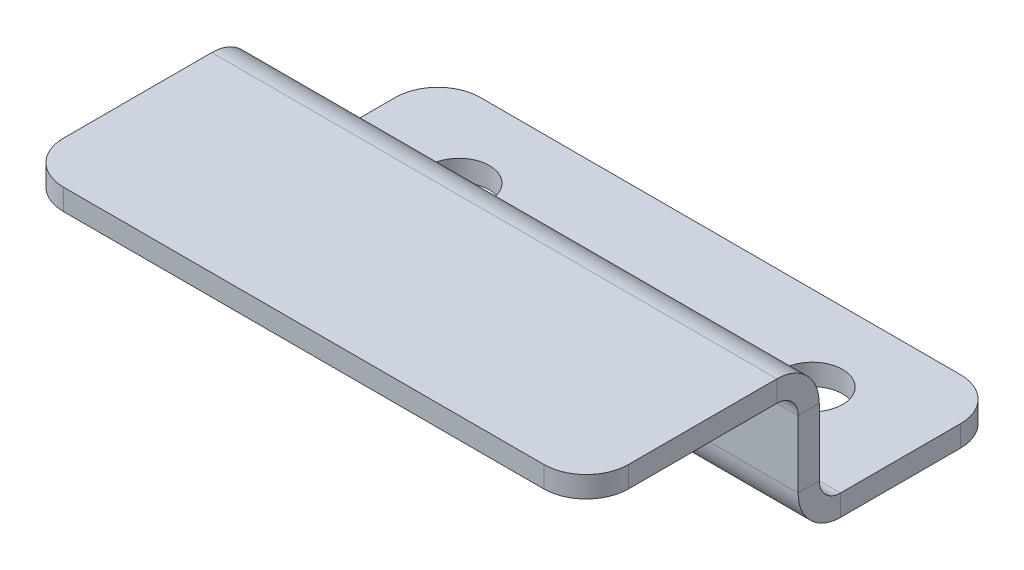
ISO-10303-21;
HEADER;
FILE_DESCRIPTION(('STEP AP214'),'2;1');
FILE_NAME('part.step','',(''),(''),'','','');
FILE_SCHEMA(('AUTOMOTIVE_DESIGN { 1 0 10303 214 1 1 1 1 }'));
ENDSEC;
DATA;
#1=APPLICATION_CONTEXT('core data for automotive mechanical design processes');
#2=APPLICATION_PROTOCOL_DEFINITION('international standard','automotive_design',2000,#1);
#3=PRODUCT_CONTEXT('',#1,'mechanical');
#4=PRODUCT('Part','Part','',(#3));
#5=PRODUCT_RELATED_PRODUCT_CATEGORY('part','',(#4));
#6=PRODUCT_DEFINITION_FORMATION('','',#4);
#7=PRODUCT_DEFINITION_CONTEXT('part definition',#1,'design');
#8=PRODUCT_DEFINITION('design','',#6,#7);
#9=PRODUCT_DEFINITION_SHAPE('','',#8);
#10=(LENGTH_UNIT() NAMED_UNIT(*) SI_UNIT(.MILLI.,.METRE.));
#11=(NAMED_UNIT(*) PLANE_ANGLE_UNIT() SI_UNIT($,.RADIAN.));
#12=(NAMED_UNIT(*) SI_UNIT($,.STERADIAN.) SOLID_ANGLE_UNIT());
#13=UNCERTAINTY_MEASURE_WITH_UNIT(LENGTH_MEASURE(1.E-05),#10,'distance_accuracy_value','');
#14=(GEOMETRIC_REPRESENTATION_CONTEXT(3) GLOBAL_UNCERTAINTY_ASSIGNED_CONTEXT((#13)) GLOBAL_UNIT_ASSIGNED_CONTEXT((#10,
#11,#12)) REPRESENTATION_CONTEXT('',''));
#15=CARTESIAN_POINT('',(0.,0.,0.));
#16=DIRECTION('',(0.,0.,1.));
#17=DIRECTION('',(1.,0.,0.));
#18=AXIS2_PLACEMENT_3D('',#15,#16,#17);
#19=CARTESIAN_POINT('',(17.,-1.5,-3.5));
#20=DIRECTION('',(0.,1.,0.));
#21=DIRECTION('',(0.,0.,1.));
#22=AXIS2_PLACEMENT_3D('',#19,#20,#21);
#23=CYLINDRICAL_SURFACE('',#22,3.);
#24=CARTESIAN_POINT('',(17.,-1.5,-3.5));
#25=DIRECTION('',(0.,-1.,0.));
#26=DIRECTION('',(0.,0.,1.));
#27=AXIS2_PLACEMENT_3D('',#24,#25,#26);
#28=CIRCLE('',#27,3.);
#29=CARTESIAN_POINT('',(17.,-1.5,-6.5));
#30=VERTEX_POINT('',#29);
#31=CARTESIAN_POINT('',(20.,-1.5,-3.5));
#32=VERTEX_POINT('',#31);
#33=EDGE_CURVE('E384',#30,#32,#28,.T.);
#34=ORIENTED_EDGE('',*,*,#33,.F.);
#35=DIRECTION('',(0.,-1.,0.));
#36=VECTOR('',#35,1.);
#37=CARTESIAN_POINT('',(17.,-1.5,-6.5));
#38=LINE('',#37,#36);
#39=CARTESIAN_POINT('',(17.,0.,-6.5));
#40=VERTEX_POINT('',#39);
#41=EDGE_CURVE('E240',#40,#30,#38,.T.);
#42=ORIENTED_EDGE('',*,*,#41,.F.);
#43=CARTESIAN_POINT('',(17.,0.,-3.5));
#44=DIRECTION('',(0.,1.,0.));
#45=DIRECTION('',(0.,0.,1.));
#46=AXIS2_PLACEMENT_3D('',#43,#44,#45);
#47=CIRCLE('',#46,3.);
#48=CARTESIAN_POINT('',(20.,0.,-3.5));
#49=VERTEX_POINT('',#48);
#50=EDGE_CURVE('E214',#49,#40,#47,.T.);
#51=ORIENTED_EDGE('',*,*,#50,.F.);
#52=DIRECTION('',(0.,1.,0.));
#53=VECTOR('',#52,1.);
#54=CARTESIAN_POINT('',(20.,-1.5,-3.5));
#55=LINE('',#54,#53);
#56=EDGE_CURVE('E363',#32,#49,#55,.T.);
#57=ORIENTED_EDGE('',*,*,#56,.F.);
#58=EDGE_LOOP('',(#34,#42,#51,#57));
#59=FACE_BOUND('',#58,.T.);
#60=ADVANCED_FACE('F17',(#59),#23,.T.);
#61=CARTESIAN_POINT('',(-17.,-1.5,-3.5));
#62=DIRECTION('',(0.,1.,0.));
#63=DIRECTION('',(0.,0.,1.));
#64=AXIS2_PLACEMENT_3D('',#61,#62,#63);
#65=CYLINDRICAL_SURFACE('',#64,3.);
#66=CARTESIAN_POINT('',(-17.,-1.5,-3.5));
#67=DIRECTION('',(0.,-1.,0.));
#68=DIRECTION('',(0.,0.,1.));
#69=AXIS2_PLACEMENT_3D('',#66,#67,#68);
#70=CIRCLE('',#69,3.);
#71=CARTESIAN_POINT('',(-20.,-1.5,-3.5));
#72=VERTEX_POINT('',#71);
#73=CARTESIAN_POINT('',(-17.,-1.5,-6.5));
#74=VERTEX_POINT('',#73);
#75=EDGE_CURVE('E394',#72,#74,#70,.T.);
#76=ORIENTED_EDGE('',*,*,#75,.F.);
#77=DIRECTION('',(0.,-1.,0.));
#78=VECTOR('',#77,1.);
#79=CARTESIAN_POINT('',(-20.,-1.5,-3.5));
#80=LINE('',#79,#78);
#81=CARTESIAN_POINT('',(-20.,0.,-3.5));
#82=VERTEX_POINT('',#81);
#83=EDGE_CURVE('E230',#82,#72,#80,.T.);
#84=ORIENTED_EDGE('',*,*,#83,.F.);
#85=CARTESIAN_POINT('',(-17.,0.,-3.5));
#86=DIRECTION('',(0.,1.,0.));
#87=DIRECTION('',(0.,0.,1.));
#88=AXIS2_PLACEMENT_3D('',#85,#86,#87);
#89=CIRCLE('',#88,3.);
#90=CARTESIAN_POINT('',(-17.,0.,-6.5));
#91=VERTEX_POINT('',#90);
#92=EDGE_CURVE('E197',#91,#82,#89,.T.);
#93=ORIENTED_EDGE('',*,*,#92,.F.);
#94=DIRECTION('',(0.,1.,0.));
#95=VECTOR('',#94,1.);
#96=CARTESIAN_POINT('',(-17.,-1.5,-6.5));
#97=LINE('',#96,#95);
#98=EDGE_CURVE('E237',#74,#91,#97,.T.);
#99=ORIENTED_EDGE('',*,*,#98,.F.);
#100=EDGE_LOOP('',(#76,#84,#93,#99));
#101=FACE_BOUND('',#100,.T.);
#102=ADVANCED_FACE('F436',(#101),#65,.T.);
#103=CARTESIAN_POINT('',(-17.,9.25,20.));
#104=DIRECTION('',(0.,-1.,0.));
#105=DIRECTION('',(0.,0.,-1.));
#106=AXIS2_PLACEMENT_3D('',#103,#104,#105);
#107=CYLINDRICAL_SURFACE('',#106,3.);
#108=CARTESIAN_POINT('',(-17.,9.25,20.));
#109=DIRECTION('',(0.,1.,0.));
#110=DIRECTION('',(0.,0.,-1.));
#111=AXIS2_PLACEMENT_3D('',#108,#109,#110);
#112=CIRCLE('',#111,3.);
#113=CARTESIAN_POINT('',(-20.,9.25,20.));
#114=VERTEX_POINT('',#113);
#115=CARTESIAN_POINT('',(-17.,9.25,23.));
#116=VERTEX_POINT('',#115);
#117=EDGE_CURVE('E276',#114,#116,#112,.T.);
#118=ORIENTED_EDGE('',*,*,#117,.F.);
#119=DIRECTION('',(0.,1.,0.));
#120=VECTOR('',#119,1.);
#121=CARTESIAN_POINT('',(-20.,9.25,20.));
#122=LINE('',#121,#120);
#123=CARTESIAN_POINT('',(-20.,7.75,20.));
#124=VERTEX_POINT('',#123);
#125=EDGE_CURVE('E288',#124,#114,#122,.T.);
#126=ORIENTED_EDGE('',*,*,#125,.F.);
#127=CARTESIAN_POINT('',(-17.,7.75,20.));
#128=DIRECTION('',(0.,-1.,0.));
#129=DIRECTION('',(0.,0.,-1.));
#130=AXIS2_PLACEMENT_3D('',#127,#128,#129);
#131=CIRCLE('',#130,3.);
#132=CARTESIAN_POINT('',(-17.,7.75,23.));
#133=VERTEX_POINT('',#132);
#134=EDGE_CURVE('E304',#133,#124,#131,.T.);
#135=ORIENTED_EDGE('',*,*,#134,.F.);
#136=DIRECTION('',(0.,-1.,0.));
#137=VECTOR('',#136,1.);
#138=CARTESIAN_POINT('',(-17.,9.25,23.));
#139=LINE('',#138,#137);
#140=EDGE_CURVE('E11',#116,#133,#139,.T.);
#141=ORIENTED_EDGE('',*,*,#140,.F.);
#142=EDGE_LOOP('',(#118,#126,#135,#141));
#143=FACE_BOUND('',#142,.T.);
#144=ADVANCED_FACE('F484',(#143),#107,.T.);
#145=CARTESIAN_POINT('',(17.,9.25,20.));
#146=DIRECTION('',(0.,-1.,0.));
#147=DIRECTION('',(0.,0.,-1.));
#148=AXIS2_PLACEMENT_3D('',#145,#146,#147);
#149=CYLINDRICAL_SURFACE('',#148,3.);
#150=CARTESIAN_POINT('',(17.,9.25,20.));
#151=DIRECTION('',(0.,1.,0.));
#152=DIRECTION('',(0.,0.,-1.));
#153=AXIS2_PLACEMENT_3D('',#150,#151,#152);
#154=CIRCLE('',#153,3.);
#155=CARTESIAN_POINT('',(17.,9.25,23.));
#156=VERTEX_POINT('',#155);
#157=CARTESIAN_POINT('',(20.,9.25,20.));
#158=VERTEX_POINT('',#157);
#159=EDGE_CURVE('E298',#156,#158,#154,.T.);
#160=ORIENTED_EDGE('',*,*,#159,.F.);
#161=DIRECTION('',(0.,1.,0.));
#162=VECTOR('',#161,1.);
#163=CARTESIAN_POINT('',(17.,9.25,23.));
#164=LINE('',#163,#162);
#165=CARTESIAN_POINT('',(17.,7.75,23.));
#166=VERTEX_POINT('',#165);
#167=EDGE_CURVE('E25',#166,#156,#164,.T.);
#168=ORIENTED_EDGE('',*,*,#167,.F.);
#169=CARTESIAN_POINT('',(17.,7.75,20.));
#170=DIRECTION('',(0.,-1.,0.));
#171=DIRECTION('',(0.,0.,-1.));
#172=AXIS2_PLACEMENT_3D('',#169,#170,#171);
#173=CIRCLE('',#172,3.);
#174=CARTESIAN_POINT('',(20.,7.75,20.));
#175=VERTEX_POINT('',#174);
#176=EDGE_CURVE('E271',#175,#166,#173,.T.);
#177=ORIENTED_EDGE('',*,*,#176,.F.);
#178=DIRECTION('',(0.,-1.,0.));
#179=VECTOR('',#178,1.);
#180=CARTESIAN_POINT('',(20.,9.25,20.));
#181=LINE('',#180,#179);
#182=EDGE_CURVE('E244',#158,#175,#181,.T.);
#183=ORIENTED_EDGE('',*,*,#182,.F.);
#184=EDGE_LOOP('',(#160,#168,#177,#183));
#185=FACE_BOUND('',#184,.T.);
#186=ADVANCED_FACE('F489',(#185),#149,.T.);
#187=CARTESIAN_POINT('',(20.,9.25,23.));
#188=DIRECTION('',(0.,0.,-1.));
#189=DIRECTION('',(0.,-1.,0.));
#190=AXIS2_PLACEMENT_3D('',#187,#188,#189);
#191=PLANE('',#190);
#192=DIRECTION('',(1.,0.,0.));
#193=VECTOR('',#192,1.);
#194=CARTESIAN_POINT('',(20.,7.75,23.));
#195=LINE('',#194,#193);
#196=EDGE_CURVE('E275',#133,#166,#195,.T.);
#197=ORIENTED_EDGE('',*,*,#196,.T.);
#198=ORIENTED_EDGE('',*,*,#167,.T.);
#199=DIRECTION('',(1.,0.,0.));
#200=VECTOR('',#199,1.);
#201=CARTESIAN_POINT('',(20.,9.25,23.));
#202=LINE('',#201,#200);
#203=EDGE_CURVE('E297',#116,#156,#202,.T.);
#204=ORIENTED_EDGE('',*,*,#203,.F.);
#205=ORIENTED_EDGE('',*,*,#140,.T.);
#206=EDGE_LOOP('',(#197,#198,#204,#205));
#207=FACE_BOUND('',#206,.T.);
#208=ADVANCED_FACE('F495',(#207),#191,.F.);
#209=CARTESIAN_POINT('',(0.,7.75,0.));
#210=DIRECTION('',(0.,-1.,0.));
#211=DIRECTION('',(-1.,0.,0.));
#212=AXIS2_PLACEMENT_3D('',#209,#210,#211);
#213=PLANE('',#212);
#214=DIRECTION('',(0.,0.,-1.));
#215=VECTOR('',#214,1.);
#216=CARTESIAN_POINT('',(20.,7.75,8.));
#217=LINE('',#216,#215);
#218=CARTESIAN_POINT('',(20.,7.75,9.5));
#219=VERTEX_POINT('',#218);
#220=EDGE_CURVE('E287',#175,#219,#217,.T.);
#221=ORIENTED_EDGE('',*,*,#220,.F.);
#222=ORIENTED_EDGE('',*,*,#176,.T.);
#223=ORIENTED_EDGE('',*,*,#196,.F.);
#224=ORIENTED_EDGE('',*,*,#134,.T.);
#225=DIRECTION('',(0.,0.,1.));
#226=VECTOR('',#225,1.);
#227=CARTESIAN_POINT('',(-20.,7.75,23.));
#228=LINE('',#227,#226);
#229=CARTESIAN_POINT('',(-20.,7.75,9.5));
#230=VERTEX_POINT('',#229);
#231=EDGE_CURVE('E293',#230,#124,#228,.T.);
#232=ORIENTED_EDGE('',*,*,#231,.F.);
#233=DIRECTION('',(-1.,0.,0.));
#234=VECTOR('',#233,1.);
#235=CARTESIAN_POINT('',(20.,7.75,9.5));
#236=LINE('',#235,#234);
#237=EDGE_CURVE('E245',#219,#230,#236,.T.);
#238=ORIENTED_EDGE('',*,*,#237,.F.);
#239=EDGE_LOOP('',(#221,#222,#223,#224,#232,#238));
#240=FACE_BOUND('',#239,.T.);
#241=ADVANCED_FACE('F496',(#240),#213,.T.);
#242=CARTESIAN_POINT('',(0.,9.25,0.));
#243=DIRECTION('',(0.,-1.,0.));
#244=DIRECTION('',(-1.,0.,0.));
#245=AXIS2_PLACEMENT_3D('',#242,#243,#244);
#246=PLANE('',#245);
#247=ORIENTED_EDGE('',*,*,#203,.T.);
#248=ORIENTED_EDGE('',*,*,#159,.T.);
#249=DIRECTION('',(0.,0.,-1.));
#250=VECTOR('',#249,1.);
#251=CARTESIAN_POINT('',(20.,9.25,8.));
#252=LINE('',#251,#250);
#253=CARTESIAN_POINT('',(20.,9.25,9.5));
#254=VERTEX_POINT('',#253);
#255=EDGE_CURVE('E241',#158,#254,#252,.T.);
#256=ORIENTED_EDGE('',*,*,#255,.T.);
#257=DIRECTION('',(1.,0.,0.));
#258=VECTOR('',#257,1.);
#259=CARTESIAN_POINT('',(0.,9.25,9.5));
#260=LINE('',#259,#258);
#261=CARTESIAN_POINT('',(-20.,9.25,9.5));
#262=VERTEX_POINT('',#261);
#263=EDGE_CURVE('E277',#262,#254,#260,.T.);
#264=ORIENTED_EDGE('',*,*,#263,.F.);
#265=DIRECTION('',(0.,0.,1.));
#266=VECTOR('',#265,1.);
#267=CARTESIAN_POINT('',(-20.,9.25,23.));
#268=LINE('',#267,#266);
#269=EDGE_CURVE('E292',#262,#114,#268,.T.);
#270=ORIENTED_EDGE('',*,*,#269,.T.);
#271=ORIENTED_EDGE('',*,*,#117,.T.);
#272=EDGE_LOOP('',(#247,#248,#256,#264,#270,#271));
#273=FACE_BOUND('',#272,.T.);
#274=ADVANCED_FACE('F499',(#273),#246,.F.);
#275=CARTESIAN_POINT('',(-20.,9.25,23.));
#276=DIRECTION('',(1.,0.,0.));
#277=DIRECTION('',(0.,1.,0.));
#278=AXIS2_PLACEMENT_3D('',#275,#276,#277);
#279=PLANE('',#278);
#280=ORIENTED_EDGE('',*,*,#231,.T.);
#281=ORIENTED_EDGE('',*,*,#125,.T.);
#282=ORIENTED_EDGE('',*,*,#269,.F.);
#283=DIRECTION('',(0.,1.,0.));
#284=VECTOR('',#283,1.);
#285=CARTESIAN_POINT('',(-20.,7.75,9.5));
#286=LINE('',#285,#284);
#287=EDGE_CURVE('E219',#230,#262,#286,.T.);
#288=ORIENTED_EDGE('',*,*,#287,.F.);
#289=EDGE_LOOP('',(#280,#281,#282,#288));
#290=FACE_BOUND('',#289,.T.);
#291=ADVANCED_FACE('F504',(#290),#279,.F.);
#292=CARTESIAN_POINT('',(20.,9.25,8.));
#293=DIRECTION('',(-1.,0.,0.));
#294=DIRECTION('',(0.,0.,1.));
#295=AXIS2_PLACEMENT_3D('',#292,#293,#294);
#296=PLANE('',#295);
#297=ORIENTED_EDGE('',*,*,#255,.F.);
#298=ORIENTED_EDGE('',*,*,#182,.T.);
#299=ORIENTED_EDGE('',*,*,#220,.T.);
#300=DIRECTION('',(0.,1.,0.));
#301=VECTOR('',#300,1.);
#302=CARTESIAN_POINT('',(20.,7.75,9.5));
#303=LINE('',#302,#301);
#304=EDGE_CURVE('E260',#219,#254,#303,.T.);
#305=ORIENTED_EDGE('',*,*,#304,.T.);
#306=EDGE_LOOP('',(#297,#298,#299,#305));
#307=FACE_BOUND('',#306,.T.);
#308=ADVANCED_FACE('F508',(#307),#296,.F.);
#309=CARTESIAN_POINT('',(-20.,6.25,9.5));
#310=DIRECTION('',(-1.,0.,0.));
#311=DIRECTION('',(0.,1.,0.));
#312=AXIS2_PLACEMENT_3D('',#309,#310,#311);
#313=CYLINDRICAL_SURFACE('',#312,1.5);
#314=DIRECTION('',(1.,0.,0.));
#315=VECTOR('',#314,1.);
#316=CARTESIAN_POINT('',(-20.,6.25,8.));
#317=LINE('',#316,#315);
#318=CARTESIAN_POINT('',(-20.,6.25,8.));
#319=VERTEX_POINT('',#318);
#320=CARTESIAN_POINT('',(20.,6.25,8.));
#321=VERTEX_POINT('',#320);
#322=EDGE_CURVE('E342',#319,#321,#317,.T.);
#323=ORIENTED_EDGE('',*,*,#322,.T.);
#324=CARTESIAN_POINT('',(20.,6.25,9.5));
#325=DIRECTION('',(1.,0.,0.));
#326=DIRECTION('',(0.,0.,1.));
#327=AXIS2_PLACEMENT_3D('',#324,#325,#326);
#328=CIRCLE('',#327,1.5);
#329=EDGE_CURVE('E261',#321,#219,#328,.T.);
#330=ORIENTED_EDGE('',*,*,#329,.T.);
#331=ORIENTED_EDGE('',*,*,#237,.T.);
#332=CARTESIAN_POINT('',(-20.,6.25,9.5));
#333=DIRECTION('',(-1.,0.,0.));
#334=DIRECTION('',(0.,0.,1.));
#335=AXIS2_PLACEMENT_3D('',#332,#333,#334);
#336=CIRCLE('',#335,1.5);
#337=EDGE_CURVE('E224',#230,#319,#336,.T.);
#338=ORIENTED_EDGE('',*,*,#337,.T.);
#339=EDGE_LOOP('',(#323,#330,#331,#338));
#340=FACE_BOUND('',#339,.T.);
#341=ADVANCED_FACE('F512',(#340),#313,.F.);
#342=CARTESIAN_POINT('',(-20.,6.25,9.5));
#343=DIRECTION('',(-1.,0.,0.));
#344=DIRECTION('',(0.,1.,0.));
#345=AXIS2_PLACEMENT_3D('',#342,#343,#344);
#346=CYLINDRICAL_SURFACE('',#345,3.);
#347=DIRECTION('',(1.,0.,0.));
#348=VECTOR('',#347,1.);
#349=CARTESIAN_POINT('',(-20.,6.25,6.5));
#350=LINE('',#349,#348);
#351=CARTESIAN_POINT('',(-20.,6.25,6.5));
#352=VERTEX_POINT('',#351);
#353=CARTESIAN_POINT('',(20.,6.25,6.5));
#354=VERTEX_POINT('',#353);
#355=EDGE_CURVE('E374',#352,#354,#350,.T.);
#356=ORIENTED_EDGE('',*,*,#355,.F.);
#357=CARTESIAN_POINT('',(-20.,6.25,9.5));
#358=DIRECTION('',(-1.,0.,0.));
#359=DIRECTION('',(0.,0.,1.));
#360=AXIS2_PLACEMENT_3D('',#357,#358,#359);
#361=CIRCLE('',#360,3.);
#362=EDGE_CURVE('E223',#262,#352,#361,.T.);
#363=ORIENTED_EDGE('',*,*,#362,.F.);
#364=ORIENTED_EDGE('',*,*,#263,.T.);
#365=CARTESIAN_POINT('',(20.,6.25,9.5));
#366=DIRECTION('',(1.,0.,0.));
#367=DIRECTION('',(0.,0.,1.));
#368=AXIS2_PLACEMENT_3D('',#365,#366,#367);
#369=CIRCLE('',#368,3.);
#370=EDGE_CURVE('E265',#354,#254,#369,.T.);
#371=ORIENTED_EDGE('',*,*,#370,.F.);
#372=EDGE_LOOP('',(#356,#363,#364,#371));
#373=FACE_BOUND('',#372,.T.);
#374=ADVANCED_FACE('F516',(#373),#346,.T.);
#375=CARTESIAN_POINT('',(-20.,6.25,9.5));
#376=DIRECTION('',(1.,0.,0.));
#377=DIRECTION('',(0.,1.,0.));
#378=AXIS2_PLACEMENT_3D('',#375,#376,#377);
#379=PLANE('',#378);
#380=ORIENTED_EDGE('',*,*,#337,.F.);
#381=ORIENTED_EDGE('',*,*,#287,.T.);
#382=ORIENTED_EDGE('',*,*,#362,.T.);
#383=DIRECTION('',(0.,0.,-1.));
#384=VECTOR('',#383,1.);
#385=CARTESIAN_POINT('',(-20.,6.25,8.));
#386=LINE('',#385,#384);
#387=EDGE_CURVE('E317',#319,#352,#386,.T.);
#388=ORIENTED_EDGE('',*,*,#387,.F.);
#389=EDGE_LOOP('',(#380,#381,#382,#388));
#390=FACE_BOUND('',#389,.T.);
#391=ADVANCED_FACE('F518',(#390),#379,.F.);
#392=CARTESIAN_POINT('',(20.,6.25,9.5));
#393=DIRECTION('',(1.,0.,0.));
#394=DIRECTION('',(0.,1.,0.));
#395=AXIS2_PLACEMENT_3D('',#392,#393,#394);
#396=PLANE('',#395);
#397=ORIENTED_EDGE('',*,*,#304,.F.);
#398=ORIENTED_EDGE('',*,*,#329,.F.);
#399=DIRECTION('',(0.,0.,-1.));
#400=VECTOR('',#399,1.);
#401=CARTESIAN_POINT('',(20.,6.25,8.));
#402=LINE('',#401,#400);
#403=EDGE_CURVE('E318',#321,#354,#402,.T.);
#404=ORIENTED_EDGE('',*,*,#403,.T.);
#405=ORIENTED_EDGE('',*,*,#370,.T.);
#406=EDGE_LOOP('',(#397,#398,#404,#405));
#407=FACE_BOUND('',#406,.T.);
#408=ADVANCED_FACE('F521',(#407),#396,.T.);
#409=CARTESIAN_POINT('',(20.,1.5,5.));
#410=DIRECTION('',(1.,0.,0.));
#411=DIRECTION('',(0.,0.,1.));
#412=AXIS2_PLACEMENT_3D('',#409,#410,#411);
#413=CYLINDRICAL_SURFACE('',#412,1.5);
#414=DIRECTION('',(-1.,0.,0.));
#415=VECTOR('',#414,1.);
#416=CARTESIAN_POINT('',(20.,0.,5.));
#417=LINE('',#416,#415);
#418=CARTESIAN_POINT('',(20.,0.,5.));
#419=VERTEX_POINT('',#418);
#420=CARTESIAN_POINT('',(-20.,0.,5.));
#421=VERTEX_POINT('',#420);
#422=EDGE_CURVE('E210',#419,#421,#417,.T.);
#423=ORIENTED_EDGE('',*,*,#422,.T.);
#424=CARTESIAN_POINT('',(-20.,1.5,5.));
#425=DIRECTION('',(-1.,0.,0.));
#426=DIRECTION('',(0.,0.,-1.));
#427=AXIS2_PLACEMENT_3D('',#424,#425,#426);
#428=CIRCLE('',#427,1.5);
#429=CARTESIAN_POINT('',(-20.,1.5,6.5));
#430=VERTEX_POINT('',#429);
#431=EDGE_CURVE('E248',#421,#430,#428,.T.);
#432=ORIENTED_EDGE('',*,*,#431,.T.);
#433=DIRECTION('',(1.,0.,0.));
#434=VECTOR('',#433,1.);
#435=CARTESIAN_POINT('',(-20.,1.5,6.5));
#436=LINE('',#435,#434);
#437=CARTESIAN_POINT('',(20.,1.5,6.5));
#438=VERTEX_POINT('',#437);
#439=EDGE_CURVE('E364',#430,#438,#436,.T.);
#440=ORIENTED_EDGE('',*,*,#439,.T.);
#441=CARTESIAN_POINT('',(20.,1.5,5.));
#442=DIRECTION('',(1.,0.,0.));
#443=DIRECTION('',(0.,0.,-1.));
#444=AXIS2_PLACEMENT_3D('',#441,#442,#443);
#445=CIRCLE('',#444,1.5);
#446=EDGE_CURVE('E254',#438,#419,#445,.T.);
#447=ORIENTED_EDGE('',*,*,#446,.T.);
#448=EDGE_LOOP('',(#423,#432,#440,#447));
#449=FACE_BOUND('',#448,.T.);
#450=ADVANCED_FACE('F444',(#449),#413,.F.);
#451=CARTESIAN_POINT('',(20.,1.5,5.));
#452=DIRECTION('',(1.,0.,0.));
#453=DIRECTION('',(0.,0.,1.));
#454=AXIS2_PLACEMENT_3D('',#451,#452,#453);
#455=CYLINDRICAL_SURFACE('',#454,3.);
#456=DIRECTION('',(-1.,0.,0.));
#457=VECTOR('',#456,1.);
#458=CARTESIAN_POINT('',(20.,-1.5,5.));
#459=LINE('',#458,#457);
#460=CARTESIAN_POINT('',(20.,-1.5,5.));
#461=VERTEX_POINT('',#460);
#462=CARTESIAN_POINT('',(-20.,-1.5,5.));
#463=VERTEX_POINT('',#462);
#464=EDGE_CURVE('E199',#461,#463,#459,.T.);
#465=ORIENTED_EDGE('',*,*,#464,.F.);
#466=CARTESIAN_POINT('',(20.,1.5,5.));
#467=DIRECTION('',(1.,0.,0.));
#468=DIRECTION('',(0.,0.,-1.));
#469=AXIS2_PLACEMENT_3D('',#466,#467,#468);
#470=CIRCLE('',#469,3.);
#471=CARTESIAN_POINT('',(20.,1.5,8.));
#472=VERTEX_POINT('',#471);
#473=EDGE_CURVE('E257',#472,#461,#470,.T.);
#474=ORIENTED_EDGE('',*,*,#473,.F.);
#475=DIRECTION('',(-1.,0.,0.));
#476=VECTOR('',#475,1.);
#477=CARTESIAN_POINT('',(0.,1.5,8.));
#478=LINE('',#477,#476);
#479=CARTESIAN_POINT('',(-20.,1.5,8.));
#480=VERTEX_POINT('',#479);
#481=EDGE_CURVE('E346',#472,#480,#478,.T.);
#482=ORIENTED_EDGE('',*,*,#481,.T.);
#483=CARTESIAN_POINT('',(-20.,1.5,5.));
#484=DIRECTION('',(-1.,0.,0.));
#485=DIRECTION('',(0.,0.,-1.));
#486=AXIS2_PLACEMENT_3D('',#483,#484,#485);
#487=CIRCLE('',#486,3.);
#488=EDGE_CURVE('E251',#463,#480,#487,.T.);
#489=ORIENTED_EDGE('',*,*,#488,.F.);
#490=EDGE_LOOP('',(#465,#474,#482,#489));
#491=FACE_BOUND('',#490,.T.);
#492=ADVANCED_FACE('F428',(#491),#455,.T.);
#493=CARTESIAN_POINT('',(20.,1.5,5.));
#494=DIRECTION('',(-1.,0.,0.));
#495=DIRECTION('',(0.,0.,1.));
#496=AXIS2_PLACEMENT_3D('',#493,#494,#495);
#497=PLANE('',#496);
#498=ORIENTED_EDGE('',*,*,#446,.F.);
#499=DIRECTION('',(0.,0.,1.));
#500=VECTOR('',#499,1.);
#501=CARTESIAN_POINT('',(20.,1.5,6.5));
#502=LINE('',#501,#500);
#503=EDGE_CURVE('E326',#438,#472,#502,.T.);
#504=ORIENTED_EDGE('',*,*,#503,.T.);
#505=ORIENTED_EDGE('',*,*,#473,.T.);
#506=DIRECTION('',(0.,-1.,0.));
#507=VECTOR('',#506,1.);
#508=CARTESIAN_POINT('',(20.,0.,5.));
#509=LINE('',#508,#507);
#510=EDGE_CURVE('E336',#419,#461,#509,.T.);
#511=ORIENTED_EDGE('',*,*,#510,.F.);
#512=EDGE_LOOP('',(#498,#504,#505,#511));
#513=FACE_BOUND('',#512,.T.);
#514=ADVANCED_FACE('F422',(#513),#497,.F.);
#515=CARTESIAN_POINT('',(-20.,1.5,5.));
#516=DIRECTION('',(-1.,0.,0.));
#517=DIRECTION('',(0.,0.,1.));
#518=AXIS2_PLACEMENT_3D('',#515,#516,#517);
#519=PLANE('',#518);
#520=DIRECTION('',(0.,0.,1.));
#521=VECTOR('',#520,1.);
#522=CARTESIAN_POINT('',(-20.,1.5,6.5));
#523=LINE('',#522,#521);
#524=EDGE_CURVE('E348',#430,#480,#523,.T.);
#525=ORIENTED_EDGE('',*,*,#524,.F.);
#526=ORIENTED_EDGE('',*,*,#431,.F.);
#527=DIRECTION('',(0.,-1.,0.));
#528=VECTOR('',#527,1.);
#529=CARTESIAN_POINT('',(-20.,0.,5.));
#530=LINE('',#529,#528);
#531=EDGE_CURVE('E233',#421,#463,#530,.T.);
#532=ORIENTED_EDGE('',*,*,#531,.T.);
#533=ORIENTED_EDGE('',*,*,#488,.T.);
#534=EDGE_LOOP('',(#525,#526,#532,#533));
#535=FACE_BOUND('',#534,.T.);
#536=ADVANCED_FACE('F464',(#535),#519,.T.);
#537=CARTESIAN_POINT('',(-12.5,-1.5,-0.5));
#538=DIRECTION('',(0.,1.,0.));
#539=DIRECTION('',(0.,0.,1.));
#540=AXIS2_PLACEMENT_3D('',#537,#538,#539);
#541=CYLINDRICAL_SURFACE('',#540,2.15);
#542=CARTESIAN_POINT('',(-12.5,-1.5,-0.5));
#543=DIRECTION('',(0.,1.,0.));
#544=DIRECTION('',(0.,0.,1.));
#545=AXIS2_PLACEMENT_3D('',#542,#543,#544);
#546=CIRCLE('',#545,2.15);
#547=CARTESIAN_POINT('',(-12.5,-1.5,1.65));
#548=VERTEX_POINT('',#547);
#549=EDGE_CURVE('E183',#548,#548,#546,.T.);
#550=ORIENTED_EDGE('',*,*,#549,.F.);
#551=EDGE_LOOP('',(#550));
#552=FACE_BOUND('',#551,.T.);
#553=CARTESIAN_POINT('',(-12.5,0.,-0.5));
#554=DIRECTION('',(0.,1.,0.));
#555=DIRECTION('',(0.,0.,1.));
#556=AXIS2_PLACEMENT_3D('',#553,#554,#555);
#557=CIRCLE('',#556,2.15);
#558=CARTESIAN_POINT('',(-12.5,0.,1.65));
#559=VERTEX_POINT('',#558);
#560=EDGE_CURVE('E218',#559,#559,#557,.T.);
#561=ORIENTED_EDGE('',*,*,#560,.T.);
#562=EDGE_LOOP('',(#561));
#563=FACE_BOUND('',#562,.T.);
#564=ADVANCED_FACE('F466',(#552,#563),#541,.F.);
#565=CARTESIAN_POINT('',(12.5,-1.5,-0.500000000000007));
#566=DIRECTION('',(0.,1.,0.));
#567=DIRECTION('',(0.,0.,1.));
#568=AXIS2_PLACEMENT_3D('',#565,#566,#567);
#569=CYLINDRICAL_SURFACE('',#568,2.15);
#570=CARTESIAN_POINT('',(12.5,-1.5,-0.500000000000007));
#571=DIRECTION('',(0.,1.,0.));
#572=DIRECTION('',(0.,0.,1.));
#573=AXIS2_PLACEMENT_3D('',#570,#571,#572);
#574=CIRCLE('',#573,2.15);
#575=CARTESIAN_POINT('',(12.5,-1.5,1.65));
#576=VERTEX_POINT('',#575);
#577=EDGE_CURVE('E189',#576,#576,#574,.T.);
#578=ORIENTED_EDGE('',*,*,#577,.F.);
#579=EDGE_LOOP('',(#578));
#580=FACE_BOUND('',#579,.T.);
#581=CARTESIAN_POINT('',(12.5,0.,-0.500000000000007));
#582=DIRECTION('',(0.,1.,0.));
#583=DIRECTION('',(0.,0.,1.));
#584=AXIS2_PLACEMENT_3D('',#581,#582,#583);
#585=CIRCLE('',#584,2.15);
#586=CARTESIAN_POINT('',(12.5,0.,1.65));
#587=VERTEX_POINT('',#586);
#588=EDGE_CURVE('E227',#587,#587,#585,.T.);
#589=ORIENTED_EDGE('',*,*,#588,.T.);
#590=EDGE_LOOP('',(#589));
#591=FACE_BOUND('',#590,.T.);
#592=ADVANCED_FACE('F474',(#580,#591),#569,.F.);
#593=CARTESIAN_POINT('',(20.,-1.5,-6.5));
#594=DIRECTION('',(0.,0.,-1.));
#595=DIRECTION('',(-1.,0.,0.));
#596=AXIS2_PLACEMENT_3D('',#593,#594,#595);
#597=PLANE('',#596);
#598=DIRECTION('',(-1.,0.,0.));
#599=VECTOR('',#598,1.);
#600=CARTESIAN_POINT('',(20.,-1.5,-6.5));
#601=LINE('',#600,#599);
#602=EDGE_CURVE('E403',#30,#74,#601,.T.);
#603=ORIENTED_EDGE('',*,*,#602,.T.);
#604=ORIENTED_EDGE('',*,*,#98,.T.);
#605=DIRECTION('',(-1.,0.,0.));
#606=VECTOR('',#605,1.);
#607=CARTESIAN_POINT('',(20.,0.,-6.5));
#608=LINE('',#607,#606);
#609=EDGE_CURVE('E188',#40,#91,#608,.T.);
#610=ORIENTED_EDGE('',*,*,#609,.F.);
#611=ORIENTED_EDGE('',*,*,#41,.T.);
#612=EDGE_LOOP('',(#603,#604,#610,#611));
#613=FACE_BOUND('',#612,.T.);
#614=ADVANCED_FACE('F439',(#613),#597,.T.);
#615=CARTESIAN_POINT('',(-20.,-1.5,6.5));
#616=DIRECTION('',(-1.,0.,0.));
#617=DIRECTION('',(0.,0.,1.));
#618=AXIS2_PLACEMENT_3D('',#615,#616,#617);
#619=PLANE('',#618);
#620=DIRECTION('',(0.,0.,1.));
#621=VECTOR('',#620,1.);
#622=CARTESIAN_POINT('',(-20.,0.,6.5));
#623=LINE('',#622,#621);
#624=EDGE_CURVE('E206',#82,#421,#623,.T.);
#625=ORIENTED_EDGE('',*,*,#624,.F.);
#626=ORIENTED_EDGE('',*,*,#83,.T.);
#627=DIRECTION('',(0.,0.,1.));
#628=VECTOR('',#627,1.);
#629=CARTESIAN_POINT('',(-20.,-1.5,6.5));
#630=LINE('',#629,#628);
#631=EDGE_CURVE('E340',#72,#463,#630,.T.);
#632=ORIENTED_EDGE('',*,*,#631,.T.);
#633=ORIENTED_EDGE('',*,*,#531,.F.);
#634=EDGE_LOOP('',(#625,#626,#632,#633));
#635=FACE_BOUND('',#634,.T.);
#636=ADVANCED_FACE('F432',(#635),#619,.T.);
#637=CARTESIAN_POINT('',(0.,0.,0.));
#638=DIRECTION('',(0.,1.,0.));
#639=DIRECTION('',(1.,0.,0.));
#640=AXIS2_PLACEMENT_3D('',#637,#638,#639);
#641=PLANE('',#640);
#642=ORIENTED_EDGE('',*,*,#588,.F.);
#643=EDGE_LOOP('',(#642));
#644=FACE_BOUND('',#643,.T.);
#645=ORIENTED_EDGE('',*,*,#560,.F.);
#646=EDGE_LOOP('',(#645));
#647=FACE_BOUND('',#646,.T.);
#648=ORIENTED_EDGE('',*,*,#609,.T.);
#649=ORIENTED_EDGE('',*,*,#92,.T.);
#650=ORIENTED_EDGE('',*,*,#624,.T.);
#651=ORIENTED_EDGE('',*,*,#422,.F.);
#652=DIRECTION('',(0.,0.,-1.));
#653=VECTOR('',#652,1.);
#654=CARTESIAN_POINT('',(20.,0.,6.5));
#655=LINE('',#654,#653);
#656=EDGE_CURVE('E341',#419,#49,#655,.T.);
#657=ORIENTED_EDGE('',*,*,#656,.T.);
#658=ORIENTED_EDGE('',*,*,#50,.T.);
#659=EDGE_LOOP('',(#648,#649,#650,#651,#657,#658));
#660=FACE_BOUND('',#659,.T.);
#661=ADVANCED_FACE('F441',(#644,#647,#660),#641,.T.);
#662=CARTESIAN_POINT('',(0.,-1.5,0.));
#663=DIRECTION('',(0.,1.,0.));
#664=DIRECTION('',(1.,0.,0.));
#665=AXIS2_PLACEMENT_3D('',#662,#663,#664);
#666=PLANE('',#665);
#667=ORIENTED_EDGE('',*,*,#549,.T.);
#668=EDGE_LOOP('',(#667));
#669=FACE_BOUND('',#668,.T.);
#670=ORIENTED_EDGE('',*,*,#577,.T.);
#671=EDGE_LOOP('',(#670));
#672=FACE_BOUND('',#671,.T.);
#673=ORIENTED_EDGE('',*,*,#631,.F.);
#674=ORIENTED_EDGE('',*,*,#75,.T.);
#675=ORIENTED_EDGE('',*,*,#602,.F.);
#676=ORIENTED_EDGE('',*,*,#33,.T.);
#677=DIRECTION('',(0.,0.,-1.));
#678=VECTOR('',#677,1.);
#679=CARTESIAN_POINT('',(20.,-1.5,6.5));
#680=LINE('',#679,#678);
#681=EDGE_CURVE('E359',#461,#32,#680,.T.);
#682=ORIENTED_EDGE('',*,*,#681,.F.);
#683=ORIENTED_EDGE('',*,*,#464,.T.);
#684=EDGE_LOOP('',(#673,#674,#675,#676,#682,#683));
#685=FACE_BOUND('',#684,.T.);
#686=ADVANCED_FACE('F184',(#669,#672,#685),#666,.F.);
#687=CARTESIAN_POINT('',(20.,-1.5,6.5));
#688=DIRECTION('',(1.,0.,0.));
#689=DIRECTION('',(0.,1.,0.));
#690=AXIS2_PLACEMENT_3D('',#687,#688,#689);
#691=PLANE('',#690);
#692=ORIENTED_EDGE('',*,*,#681,.T.);
#693=ORIENTED_EDGE('',*,*,#56,.T.);
#694=ORIENTED_EDGE('',*,*,#656,.F.);
#695=ORIENTED_EDGE('',*,*,#510,.T.);
#696=EDGE_LOOP('',(#692,#693,#694,#695));
#697=FACE_BOUND('',#696,.T.);
#698=ADVANCED_FACE('F419',(#697),#691,.T.);
#699=CARTESIAN_POINT('',(0.,0.,6.5));
#700=DIRECTION('',(0.,0.,-1.));
#701=DIRECTION('',(0.,-1.,0.));
#702=AXIS2_PLACEMENT_3D('',#699,#700,#701);
#703=PLANE('',#702);
#704=DIRECTION('',(0.,-1.,0.));
#705=VECTOR('',#704,1.);
#706=CARTESIAN_POINT('',(-20.,0.,6.5));
#707=LINE('',#706,#705);
#708=EDGE_CURVE('E352',#352,#430,#707,.T.);
#709=ORIENTED_EDGE('',*,*,#708,.F.);
#710=ORIENTED_EDGE('',*,*,#355,.T.);
#711=DIRECTION('',(0.,1.,0.));
#712=VECTOR('',#711,1.);
#713=CARTESIAN_POINT('',(20.,7.75,6.5));
#714=LINE('',#713,#712);
#715=EDGE_CURVE('E330',#438,#354,#714,.T.);
#716=ORIENTED_EDGE('',*,*,#715,.F.);
#717=ORIENTED_EDGE('',*,*,#439,.F.);
#718=EDGE_LOOP('',(#709,#710,#716,#717));
#719=FACE_BOUND('',#718,.T.);
#720=ADVANCED_FACE('F450',(#719),#703,.T.);
#721=CARTESIAN_POINT('',(0.,0.,8.));
#722=DIRECTION('',(0.,0.,-1.));
#723=DIRECTION('',(0.,-1.,0.));
#724=AXIS2_PLACEMENT_3D('',#721,#722,#723);
#725=PLANE('',#724);
#726=ORIENTED_EDGE('',*,*,#322,.F.);
#727=DIRECTION('',(0.,-1.,0.));
#728=VECTOR('',#727,1.);
#729=CARTESIAN_POINT('',(-20.,0.,8.));
#730=LINE('',#729,#728);
#731=EDGE_CURVE('E347',#319,#480,#730,.T.);
#732=ORIENTED_EDGE('',*,*,#731,.T.);
#733=ORIENTED_EDGE('',*,*,#481,.F.);
#734=DIRECTION('',(0.,1.,0.));
#735=VECTOR('',#734,1.);
#736=CARTESIAN_POINT('',(20.,7.75,8.));
#737=LINE('',#736,#735);
#738=EDGE_CURVE('E322',#472,#321,#737,.T.);
#739=ORIENTED_EDGE('',*,*,#738,.T.);
#740=EDGE_LOOP('',(#726,#732,#733,#739));
#741=FACE_BOUND('',#740,.T.);
#742=ADVANCED_FACE('F457',(#741),#725,.F.);
#743=CARTESIAN_POINT('',(-20.,0.,8.));
#744=DIRECTION('',(1.,0.,0.));
#745=DIRECTION('',(0.,1.,0.));
#746=AXIS2_PLACEMENT_3D('',#743,#744,#745);
#747=PLANE('',#746);
#748=ORIENTED_EDGE('',*,*,#387,.T.);
#749=ORIENTED_EDGE('',*,*,#708,.T.);
#750=ORIENTED_EDGE('',*,*,#524,.T.);
#751=ORIENTED_EDGE('',*,*,#731,.F.);
#752=EDGE_LOOP('',(#748,#749,#750,#751));
#753=FACE_BOUND('',#752,.T.);
#754=ADVANCED_FACE('F462',(#753),#747,.F.);
#755=CARTESIAN_POINT('',(20.,7.75,8.));
#756=DIRECTION('',(-1.,0.,0.));
#757=DIRECTION('',(0.,1.,0.));
#758=AXIS2_PLACEMENT_3D('',#755,#756,#757);
#759=PLANE('',#758);
#760=ORIENTED_EDGE('',*,*,#403,.F.);
#761=ORIENTED_EDGE('',*,*,#738,.F.);
#762=ORIENTED_EDGE('',*,*,#503,.F.);
#763=ORIENTED_EDGE('',*,*,#715,.T.);
#764=EDGE_LOOP('',(#760,#761,#762,#763));
#765=FACE_BOUND('',#764,.T.);
#766=ADVANCED_FACE('F454',(#765),#759,.F.);
#767=CLOSED_SHELL('',(#60,#102,#144,#186,#208,#241,#274,#291,#308,#341,#374,#391,#408,#450,#492,
#514,#536,#564,#592,#614,#636,#661,#686,#698,#720,#742,#754,#766));
#768=MANIFOLD_SOLID_BREP('B1',#767);
#769=ADVANCED_BREP_SHAPE_REPRESENTATION('',(#18,#768),#14);
#770=SHAPE_DEFINITION_REPRESENTATION(#9,#769);
ENDSEC;
END-ISO-10303-21;
